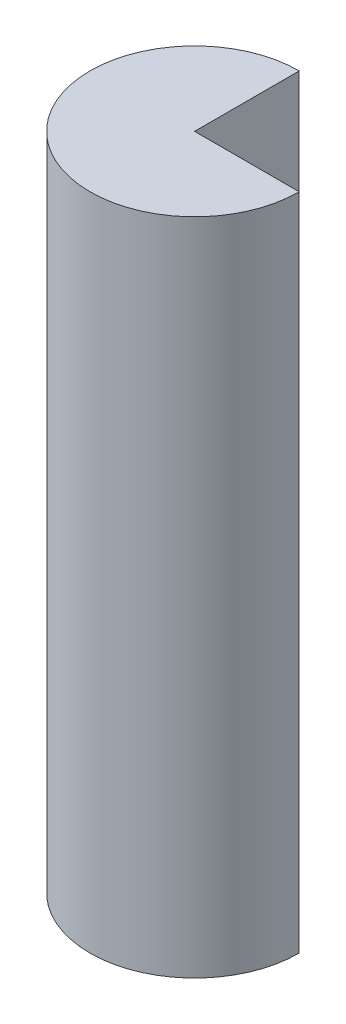
ISO-10303-21;
HEADER;
FILE_DESCRIPTION(('STEP AP214'),'2;1');
FILE_NAME('part.step','',(''),(''),'','','');
FILE_SCHEMA(('AUTOMOTIVE_DESIGN { 1 0 10303 214 1 1 1 1 }'));
ENDSEC;
DATA;
#1=APPLICATION_CONTEXT('core data for automotive mechanical design processes');
#2=APPLICATION_PROTOCOL_DEFINITION('international standard','automotive_design',2000,#1);
#3=PRODUCT_CONTEXT('',#1,'mechanical');
#4=PRODUCT('Part','Part','',(#3));
#5=PRODUCT_RELATED_PRODUCT_CATEGORY('part','',(#4));
#6=PRODUCT_DEFINITION_FORMATION('','',#4);
#7=PRODUCT_DEFINITION_CONTEXT('part definition',#1,'design');
#8=PRODUCT_DEFINITION('design','',#6,#7);
#9=PRODUCT_DEFINITION_SHAPE('','',#8);
#10=(LENGTH_UNIT() NAMED_UNIT(*) SI_UNIT(.MILLI.,.METRE.));
#11=(NAMED_UNIT(*) PLANE_ANGLE_UNIT() SI_UNIT($,.RADIAN.));
#12=(NAMED_UNIT(*) SI_UNIT($,.STERADIAN.) SOLID_ANGLE_UNIT());
#13=UNCERTAINTY_MEASURE_WITH_UNIT(LENGTH_MEASURE(1.E-05),#10,'distance_accuracy_value','');
#14=(GEOMETRIC_REPRESENTATION_CONTEXT(3) GLOBAL_UNCERTAINTY_ASSIGNED_CONTEXT((#13)) GLOBAL_UNIT_ASSIGNED_CONTEXT((#10,
#11,#12)) REPRESENTATION_CONTEXT('',''));
#15=CARTESIAN_POINT('',(0.,0.,0.));
#16=DIRECTION('',(0.,0.,1.));
#17=DIRECTION('',(1.,0.,0.));
#18=AXIS2_PLACEMENT_3D('',#15,#16,#17);
#19=CARTESIAN_POINT('',(0.,80.,0.));
#20=DIRECTION('',(0.,0.,1.));
#21=DIRECTION('',(1.,0.,0.));
#22=AXIS2_PLACEMENT_3D('',#19,#20,#21);
#23=PLANE('',#22);
#24=DIRECTION('',(-1.,0.,0.));
#25=VECTOR('',#24,1.);
#26=CARTESIAN_POINT('',(0.,0.,0.));
#27=LINE('',#26,#25);
#28=CARTESIAN_POINT('',(12.7,0.,0.));
#29=VERTEX_POINT('',#28);
#30=CARTESIAN_POINT('',(0.,0.,0.));
#31=VERTEX_POINT('',#30);
#32=EDGE_CURVE('E81',#29,#31,#27,.T.);
#33=ORIENTED_EDGE('',*,*,#32,.T.);
#34=DIRECTION('',(0.,-1.,0.));
#35=VECTOR('',#34,1.);
#36=CARTESIAN_POINT('',(0.,80.,0.));
#37=LINE('',#36,#35);
#38=CARTESIAN_POINT('',(0.,80.,0.));
#39=VERTEX_POINT('',#38);
#40=EDGE_CURVE('E11',#39,#31,#37,.T.);
#41=ORIENTED_EDGE('',*,*,#40,.F.);
#42=DIRECTION('',(-1.,0.,0.));
#43=VECTOR('',#42,1.);
#44=CARTESIAN_POINT('',(0.,80.,0.));
#45=LINE('',#44,#43);
#46=CARTESIAN_POINT('',(12.7,80.,0.));
#47=VERTEX_POINT('',#46);
#48=EDGE_CURVE('E74',#47,#39,#45,.T.);
#49=ORIENTED_EDGE('',*,*,#48,.F.);
#50=DIRECTION('',(0.,-1.,0.));
#51=VECTOR('',#50,1.);
#52=CARTESIAN_POINT('',(12.7,80.,0.));
#53=LINE('',#52,#51);
#54=EDGE_CURVE('E82',#47,#29,#53,.T.);
#55=ORIENTED_EDGE('',*,*,#54,.T.);
#56=EDGE_LOOP('',(#33,#41,#49,#55));
#57=FACE_BOUND('',#56,.T.);
#58=ADVANCED_FACE('F34',(#57),#23,.F.);
#59=CARTESIAN_POINT('',(0.,80.,0.));
#60=DIRECTION('',(-1.,0.,0.));
#61=DIRECTION('',(0.,0.,1.));
#62=AXIS2_PLACEMENT_3D('',#59,#60,#61);
#63=PLANE('',#62);
#64=DIRECTION('',(0.,0.,-1.));
#65=VECTOR('',#64,1.);
#66=CARTESIAN_POINT('',(0.,0.,0.));
#67=LINE('',#66,#65);
#68=CARTESIAN_POINT('',(0.,0.,-12.7));
#69=VERTEX_POINT('',#68);
#70=EDGE_CURVE('E62',#31,#69,#67,.T.);
#71=ORIENTED_EDGE('',*,*,#70,.T.);
#72=DIRECTION('',(0.,-1.,0.));
#73=VECTOR('',#72,1.);
#74=CARTESIAN_POINT('',(0.,80.,-12.7));
#75=LINE('',#74,#73);
#76=CARTESIAN_POINT('',(0.,80.,-12.7));
#77=VERTEX_POINT('',#76);
#78=EDGE_CURVE('E42',#77,#69,#75,.T.);
#79=ORIENTED_EDGE('',*,*,#78,.F.);
#80=DIRECTION('',(0.,0.,-1.));
#81=VECTOR('',#80,1.);
#82=CARTESIAN_POINT('',(0.,80.,0.));
#83=LINE('',#82,#81);
#84=EDGE_CURVE('E70',#39,#77,#83,.T.);
#85=ORIENTED_EDGE('',*,*,#84,.F.);
#86=ORIENTED_EDGE('',*,*,#40,.T.);
#87=EDGE_LOOP('',(#71,#79,#85,#86));
#88=FACE_BOUND('',#87,.T.);
#89=ADVANCED_FACE('F71',(#88),#63,.F.);
#90=CARTESIAN_POINT('',(0.,80.,0.));
#91=DIRECTION('',(0.,-1.,0.));
#92=DIRECTION('',(0.,0.,-1.));
#93=AXIS2_PLACEMENT_3D('',#90,#91,#92);
#94=CYLINDRICAL_SURFACE('',#93,12.7);
#95=CARTESIAN_POINT('',(0.,0.,0.));
#96=DIRECTION('',(0.,1.,0.));
#97=DIRECTION('',(0.,0.,1.));
#98=AXIS2_PLACEMENT_3D('',#95,#96,#97);
#99=CIRCLE('',#98,12.7);
#100=EDGE_CURVE('E67',#69,#29,#99,.T.);
#101=ORIENTED_EDGE('',*,*,#100,.T.);
#102=ORIENTED_EDGE('',*,*,#54,.F.);
#103=CARTESIAN_POINT('',(0.,80.,0.));
#104=DIRECTION('',(0.,1.,0.));
#105=DIRECTION('',(0.,0.,1.));
#106=AXIS2_PLACEMENT_3D('',#103,#104,#105);
#107=CIRCLE('',#106,12.7);
#108=EDGE_CURVE('E50',#77,#47,#107,.T.);
#109=ORIENTED_EDGE('',*,*,#108,.F.);
#110=ORIENTED_EDGE('',*,*,#78,.T.);
#111=EDGE_LOOP('',(#101,#102,#109,#110));
#112=FACE_BOUND('',#111,.T.);
#113=ADVANCED_FACE('F89',(#112),#94,.T.);
#114=CARTESIAN_POINT('',(0.,80.,0.));
#115=DIRECTION('',(0.,1.,0.));
#116=DIRECTION('',(0.,0.,1.));
#117=AXIS2_PLACEMENT_3D('',#114,#115,#116);
#118=PLANE('',#117);
#119=ORIENTED_EDGE('',*,*,#48,.T.);
#120=ORIENTED_EDGE('',*,*,#84,.T.);
#121=ORIENTED_EDGE('',*,*,#108,.T.);
#122=EDGE_LOOP('',(#119,#120,#121));
#123=FACE_BOUND('',#122,.T.);
#124=ADVANCED_FACE('F77',(#123),#118,.T.);
#125=CARTESIAN_POINT('',(0.,0.,0.));
#126=DIRECTION('',(0.,1.,0.));
#127=DIRECTION('',(0.,0.,1.));
#128=AXIS2_PLACEMENT_3D('',#125,#126,#127);
#129=PLANE('',#128);
#130=ORIENTED_EDGE('',*,*,#32,.F.);
#131=ORIENTED_EDGE('',*,*,#100,.F.);
#132=ORIENTED_EDGE('',*,*,#70,.F.);
#133=EDGE_LOOP('',(#130,#131,#132));
#134=FACE_BOUND('',#133,.T.);
#135=ADVANCED_FACE('F90',(#134),#129,.F.);
#136=CLOSED_SHELL('',(#58,#89,#113,#124,#135));
#137=MANIFOLD_SOLID_BREP('B2',#136);
#138=ADVANCED_BREP_SHAPE_REPRESENTATION('',(#18,#137),#14);
#139=SHAPE_DEFINITION_REPRESENTATION(#9,#138);
ENDSEC;
END-ISO-10303-21;
